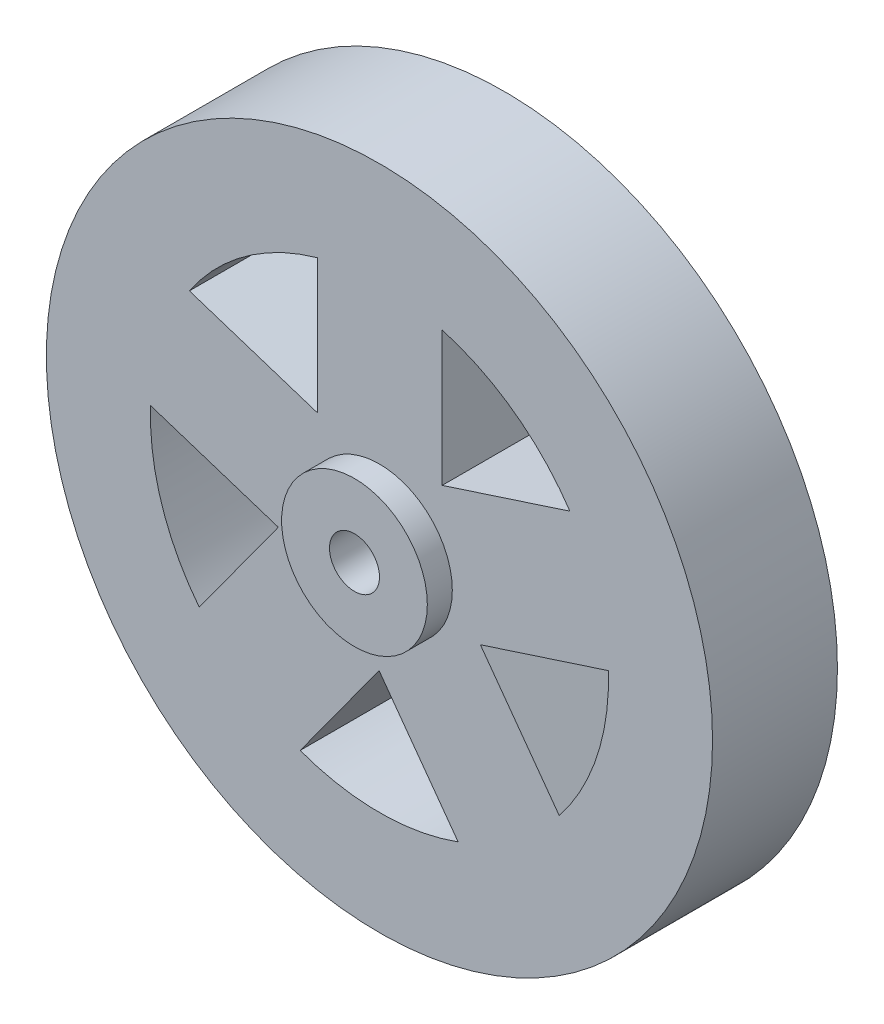
ISO-10303-21;
HEADER;
FILE_DESCRIPTION(('STEP AP214'),'2;1');
FILE_NAME('part.step','',(''),(''),'','','');
FILE_SCHEMA(('AUTOMOTIVE_DESIGN { 1 0 10303 214 1 1 1 1 }'));
ENDSEC;
DATA;
#1=APPLICATION_CONTEXT('core data for automotive mechanical design processes');
#2=APPLICATION_PROTOCOL_DEFINITION('international standard','automotive_design',2000,#1);
#3=PRODUCT_CONTEXT('',#1,'mechanical');
#4=PRODUCT('Part','Part','',(#3));
#5=PRODUCT_RELATED_PRODUCT_CATEGORY('part','',(#4));
#6=PRODUCT_DEFINITION_FORMATION('','',#4);
#7=PRODUCT_DEFINITION_CONTEXT('part definition',#1,'design');
#8=PRODUCT_DEFINITION('design','',#6,#7);
#9=PRODUCT_DEFINITION_SHAPE('','',#8);
#10=(LENGTH_UNIT() NAMED_UNIT(*) SI_UNIT(.MILLI.,.METRE.));
#11=(NAMED_UNIT(*) PLANE_ANGLE_UNIT() SI_UNIT($,.RADIAN.));
#12=(NAMED_UNIT(*) SI_UNIT($,.STERADIAN.) SOLID_ANGLE_UNIT());
#13=UNCERTAINTY_MEASURE_WITH_UNIT(LENGTH_MEASURE(1.E-05),#10,'distance_accuracy_value','');
#14=(GEOMETRIC_REPRESENTATION_CONTEXT(3) GLOBAL_UNCERTAINTY_ASSIGNED_CONTEXT((#13)) GLOBAL_UNIT_ASSIGNED_CONTEXT((#10,
#11,#12)) REPRESENTATION_CONTEXT('',''));
#15=CARTESIAN_POINT('',(0.,0.,0.));
#16=DIRECTION('',(0.,0.,1.));
#17=DIRECTION('',(1.,0.,0.));
#18=AXIS2_PLACEMENT_3D('',#15,#16,#17);
#19=CARTESIAN_POINT('',(7.53732450032553,40.001,0.));
#20=DIRECTION('',(-1.,0.,0.));
#21=DIRECTION('',(0.,0.,1.));
#22=AXIS2_PLACEMENT_3D('',#19,#20,#21);
#23=PLANE('',#22);
#24=DIRECTION('',(0.,0.,1.));
#25=VECTOR('',#24,1.);
#26=CARTESIAN_POINT('',(7.53732450032553,10.2957465667107,0.));
#27=LINE('',#26,#25);
#28=CARTESIAN_POINT('',(7.53732450032553,10.2957465667107,0.));
#29=VERTEX_POINT('',#28);
#30=CARTESIAN_POINT('',(7.53732450032553,10.2957465667107,15.));
#31=VERTEX_POINT('',#30);
#32=EDGE_CURVE('E223',#29,#31,#27,.T.);
#33=ORIENTED_EDGE('',*,*,#32,.F.);
#34=DIRECTION('',(0.,-1.,0.));
#35=VECTOR('',#34,1.);
#36=CARTESIAN_POINT('',(7.53732450032553,40.001,0.));
#37=LINE('',#36,#35);
#38=CARTESIAN_POINT('',(7.53732450032553,26.4469041548683,0.));
#39=VERTEX_POINT('',#38);
#40=EDGE_CURVE('E222',#39,#29,#37,.T.);
#41=ORIENTED_EDGE('',*,*,#40,.F.);
#42=DIRECTION('',(0.,0.,1.));
#43=VECTOR('',#42,1.);
#44=CARTESIAN_POINT('',(7.53732450032553,26.4469041548683,0.));
#45=LINE('',#44,#43);
#46=CARTESIAN_POINT('',(7.53732450032553,26.4469041548683,15.));
#47=VERTEX_POINT('',#46);
#48=EDGE_CURVE('E212',#47,#39,#45,.F.);
#49=ORIENTED_EDGE('',*,*,#48,.F.);
#50=DIRECTION('',(0.,-1.,0.));
#51=VECTOR('',#50,1.);
#52=CARTESIAN_POINT('',(7.53732450032553,40.001,15.));
#53=LINE('',#52,#51);
#54=EDGE_CURVE('E218',#47,#31,#53,.T.);
#55=ORIENTED_EDGE('',*,*,#54,.T.);
#56=EDGE_LOOP('',(#33,#41,#49,#55));
#57=FACE_BOUND('',#56,.T.);
#58=ADVANCED_FACE('F43',(#57),#23,.F.);
#59=CARTESIAN_POINT('',(-7.46267549967447,40.001,0.));
#60=DIRECTION('',(1.,0.,0.));
#61=DIRECTION('',(0.,0.,-1.));
#62=AXIS2_PLACEMENT_3D('',#59,#60,#61);
#63=PLANE('',#62);
#64=DIRECTION('',(0.,0.,-1.));
#65=VECTOR('',#64,1.);
#66=CARTESIAN_POINT('',(-7.46267549967447,10.349982240357,0.));
#67=LINE('',#66,#65);
#68=CARTESIAN_POINT('',(-7.46267549967447,10.349982240357,15.));
#69=VERTEX_POINT('',#68);
#70=CARTESIAN_POINT('',(-7.46267549967447,10.349982240357,0.));
#71=VERTEX_POINT('',#70);
#72=EDGE_CURVE('E157',#69,#71,#67,.T.);
#73=ORIENTED_EDGE('',*,*,#72,.F.);
#74=DIRECTION('',(0.,-1.,0.));
#75=VECTOR('',#74,1.);
#76=CARTESIAN_POINT('',(-7.46267549967447,40.001,15.));
#77=LINE('',#76,#75);
#78=CARTESIAN_POINT('',(-7.46267549967447,26.4680651802613,15.));
#79=VERTEX_POINT('',#78);
#80=EDGE_CURVE('E215',#79,#69,#77,.T.);
#81=ORIENTED_EDGE('',*,*,#80,.F.);
#82=DIRECTION('',(0.,0.,1.));
#83=VECTOR('',#82,1.);
#84=CARTESIAN_POINT('',(-7.46267549967447,26.4680651802613,0.));
#85=LINE('',#84,#83);
#86=CARTESIAN_POINT('',(-7.46267549967447,26.4680651802613,0.));
#87=VERTEX_POINT('',#86);
#88=EDGE_CURVE('E204',#87,#79,#85,.T.);
#89=ORIENTED_EDGE('',*,*,#88,.F.);
#90=DIRECTION('',(0.,-1.,0.));
#91=VECTOR('',#90,1.);
#92=CARTESIAN_POINT('',(-7.46267549967447,40.001,0.));
#93=LINE('',#92,#91);
#94=EDGE_CURVE('E179',#87,#71,#93,.T.);
#95=ORIENTED_EDGE('',*,*,#94,.T.);
#96=EDGE_LOOP('',(#73,#81,#89,#95));
#97=FACE_BOUND('',#96,.T.);
#98=ADVANCED_FACE('F390',(#97),#63,.F.);
#99=CARTESIAN_POINT('',(0.,0.,0.));
#100=DIRECTION('',(0.,0.,1.));
#101=DIRECTION('',(1.,0.,0.));
#102=AXIS2_PLACEMENT_3D('',#99,#100,#101);
#103=CYLINDRICAL_SURFACE('',#102,27.5);
#104=DIRECTION('',(0.,0.,1.));
#105=VECTOR('',#104,1.);
#106=CARTESIAN_POINT('',(27.4816618950402,1.00412125099394,0.));
#107=LINE('',#106,#105);
#108=CARTESIAN_POINT('',(27.4816618950402,1.00412125099394,15.));
#109=VERTEX_POINT('',#108);
#110=CARTESIAN_POINT('',(27.4816618950402,1.00412125099394,0.));
#111=VERTEX_POINT('',#110);
#112=EDGE_CURVE('E238',#109,#111,#107,.F.);
#113=ORIENTED_EDGE('',*,*,#112,.T.);
#114=CARTESIAN_POINT('',(0.,0.,0.));
#115=DIRECTION('',(0.,0.,1.));
#116=DIRECTION('',(1.,0.,0.));
#117=AXIS2_PLACEMENT_3D('',#114,#115,#116);
#118=CIRCLE('',#117,27.5);
#119=CARTESIAN_POINT('',(21.5949696724156,-17.0266639377023,0.));
#120=VERTEX_POINT('',#119);
#121=EDGE_CURVE('E192',#120,#111,#118,.T.);
#122=ORIENTED_EDGE('',*,*,#121,.F.);
#123=DIRECTION('',(0.,0.,1.));
#124=VECTOR('',#123,1.);
#125=CARTESIAN_POINT('',(21.5949696724156,-17.0266639377023,0.));
#126=LINE('',#125,#124);
#127=CARTESIAN_POINT('',(21.5949696724156,-17.0266639377023,15.));
#128=VERTEX_POINT('',#127);
#129=EDGE_CURVE('E258',#120,#128,#126,.T.);
#130=ORIENTED_EDGE('',*,*,#129,.T.);
#131=CARTESIAN_POINT('',(0.,0.,15.));
#132=DIRECTION('',(0.,0.,1.));
#133=DIRECTION('',(1.,0.,0.));
#134=AXIS2_PLACEMENT_3D('',#131,#132,#133);
#135=CIRCLE('',#134,27.5);
#136=EDGE_CURVE('E203',#128,#109,#135,.T.);
#137=ORIENTED_EDGE('',*,*,#136,.T.);
#138=EDGE_LOOP('',(#113,#122,#130,#137));
#139=FACE_BOUND('',#138,.T.);
#140=ADVANCED_FACE('F396',(#139),#103,.F.);
#141=DIRECTION('',(0.,0.,1.));
#142=VECTOR('',#141,1.);
#143=CARTESIAN_POINT('',(22.8665323105074,15.2765081118861,0.));
#144=LINE('',#143,#142);
#145=CARTESIAN_POINT('',(22.8665323105074,15.2765081118861,0.));
#146=VERTEX_POINT('',#145);
#147=CARTESIAN_POINT('',(22.8665323105074,15.2765081118861,15.));
#148=VERTEX_POINT('',#147);
#149=EDGE_CURVE('E235',#146,#148,#144,.T.);
#150=ORIENTED_EDGE('',*,*,#149,.T.);
#151=EDGE_CURVE('E198',#148,#47,#135,.T.);
#152=ORIENTED_EDGE('',*,*,#151,.T.);
#153=ORIENTED_EDGE('',*,*,#48,.T.);
#154=EDGE_CURVE('E183',#146,#39,#118,.T.);
#155=ORIENTED_EDGE('',*,*,#154,.F.);
#156=EDGE_LOOP('',(#150,#152,#153,#155));
#157=FACE_BOUND('',#156,.T.);
#158=ADVANCED_FACE('F403',(#157),#103,.F.);
#159=DIRECTION('',(0.,0.,1.));
#160=VECTOR('',#159,1.);
#161=CARTESIAN_POINT('',(-22.8233391696015,15.3409644139257,0.));
#162=LINE('',#161,#160);
#163=CARTESIAN_POINT('',(-22.8233391696015,15.3409644139257,15.));
#164=VERTEX_POINT('',#163);
#165=CARTESIAN_POINT('',(-22.8233391696015,15.3409644139257,0.));
#166=VERTEX_POINT('',#165);
#167=EDGE_CURVE('E154',#164,#166,#162,.F.);
#168=ORIENTED_EDGE('',*,*,#167,.T.);
#169=EDGE_CURVE('E170',#87,#166,#118,.T.);
#170=ORIENTED_EDGE('',*,*,#169,.F.);
#171=ORIENTED_EDGE('',*,*,#88,.T.);
#172=EDGE_CURVE('E172',#79,#164,#135,.T.);
#173=ORIENTED_EDGE('',*,*,#172,.T.);
#174=EDGE_LOOP('',(#168,#170,#171,#173));
#175=FACE_BOUND('',#174,.T.);
#176=ADVANCED_FACE('F168',(#175),#103,.F.);
#177=DIRECTION('',(0.,0.,1.));
#178=VECTOR('',#177,1.);
#179=CARTESIAN_POINT('',(9.44727661814199,-25.826323092928,0.));
#180=LINE('',#179,#178);
#181=CARTESIAN_POINT('',(9.44727661814199,-25.826323092928,15.));
#182=VERTEX_POINT('',#181);
#183=CARTESIAN_POINT('',(9.44727661814199,-25.826323092928,0.));
#184=VERTEX_POINT('',#183);
#185=EDGE_CURVE('E262',#182,#184,#180,.F.);
#186=ORIENTED_EDGE('',*,*,#185,.T.);
#187=CARTESIAN_POINT('',(-9.52010706693152,-25.7995651404081,0.));
#188=VERTEX_POINT('',#187);
#189=EDGE_CURVE('E188',#188,#184,#118,.T.);
#190=ORIENTED_EDGE('',*,*,#189,.F.);
#191=DIRECTION('',(0.,0.,1.));
#192=VECTOR('',#191,1.);
#193=CARTESIAN_POINT('',(-9.52010706693152,-25.7995651404081,0.));
#194=LINE('',#193,#192);
#195=CARTESIAN_POINT('',(-9.52010706693152,-25.7995651404081,15.));
#196=VERTEX_POINT('',#195);
#197=EDGE_CURVE('E283',#188,#196,#194,.T.);
#198=ORIENTED_EDGE('',*,*,#197,.T.);
#199=EDGE_CURVE('E201',#196,#182,#135,.T.);
#200=ORIENTED_EDGE('',*,*,#199,.T.);
#201=EDGE_LOOP('',(#186,#190,#198,#200));
#202=FACE_BOUND('',#201,.T.);
#203=ADVANCED_FACE('F409',(#202),#103,.F.);
#204=DIRECTION('',(0.,0.,1.));
#205=VECTOR('',#204,1.);
#206=CARTESIAN_POINT('',(-21.6429238439063,-16.9656667268596,0.));
#207=LINE('',#206,#205);
#208=CARTESIAN_POINT('',(-21.6429238439063,-16.9656667268596,15.));
#209=VERTEX_POINT('',#208);
#210=CARTESIAN_POINT('',(-21.6429238439063,-16.9656667268596,0.));
#211=VERTEX_POINT('',#210);
#212=EDGE_CURVE('E287',#209,#211,#207,.F.);
#213=ORIENTED_EDGE('',*,*,#212,.T.);
#214=CARTESIAN_POINT('',(-27.4787194163173,1.08165578596325,0.));
#215=VERTEX_POINT('',#214);
#216=EDGE_CURVE('E181',#215,#211,#118,.T.);
#217=ORIENTED_EDGE('',*,*,#216,.F.);
#218=DIRECTION('',(0.,0.,1.));
#219=VECTOR('',#218,1.);
#220=CARTESIAN_POINT('',(-27.4787194163173,1.08165578596325,0.));
#221=LINE('',#220,#219);
#222=CARTESIAN_POINT('',(-27.4787194163173,1.08165578596326,15.));
#223=VERTEX_POINT('',#222);
#224=EDGE_CURVE('E174',#215,#223,#221,.T.);
#225=ORIENTED_EDGE('',*,*,#224,.T.);
#226=EDGE_CURVE('E197',#223,#209,#135,.T.);
#227=ORIENTED_EDGE('',*,*,#226,.T.);
#228=EDGE_LOOP('',(#213,#217,#225,#227));
#229=FACE_BOUND('',#228,.T.);
#230=ADVANCED_FACE('F379',(#229),#103,.F.);
#231=CARTESIAN_POINT('',(0.,0.,15.));
#232=DIRECTION('',(0.,0.,-1.));
#233=DIRECTION('',(-1.,0.,0.));
#234=AXIS2_PLACEMENT_3D('',#231,#232,#233);
#235=CYLINDRICAL_SURFACE('',#234,40.);
#236=CARTESIAN_POINT('',(0.,0.,15.));
#237=DIRECTION('',(0.,0.,1.));
#238=DIRECTION('',(1.,0.,0.));
#239=AXIS2_PLACEMENT_3D('',#236,#237,#238);
#240=CIRCLE('',#239,40.);
#241=CARTESIAN_POINT('',(40.,0.,15.));
#242=VERTEX_POINT('',#241);
#243=EDGE_CURVE('E11',#242,#242,#240,.T.);
#244=ORIENTED_EDGE('',*,*,#243,.F.);
#245=EDGE_LOOP('',(#244));
#246=FACE_BOUND('',#245,.T.);
#247=CARTESIAN_POINT('',(0.,0.,0.));
#248=DIRECTION('',(0.,0.,1.));
#249=DIRECTION('',(1.,0.,0.));
#250=AXIS2_PLACEMENT_3D('',#247,#248,#249);
#251=CIRCLE('',#250,40.);
#252=CARTESIAN_POINT('',(40.,0.,0.));
#253=VERTEX_POINT('',#252);
#254=EDGE_CURVE('E47',#253,#253,#251,.T.);
#255=ORIENTED_EDGE('',*,*,#254,.T.);
#256=EDGE_LOOP('',(#255));
#257=FACE_BOUND('',#256,.T.);
#258=ADVANCED_FACE('F45',(#246,#257),#235,.T.);
#259=CARTESIAN_POINT('',(0.,0.,15.));
#260=DIRECTION('',(0.,0.,1.));
#261=DIRECTION('',(1.,0.,0.));
#262=AXIS2_PLACEMENT_3D('',#259,#260,#261);
#263=PLANE('',#262);
#264=CARTESIAN_POINT('',(0.,0.,15.));
#265=DIRECTION('',(0.,0.,1.));
#266=DIRECTION('',(1.,0.,0.));
#267=AXIS2_PLACEMENT_3D('',#264,#265,#266);
#268=CIRCLE('',#267,8.75);
#269=CARTESIAN_POINT('',(8.75,0.,15.));
#270=VERTEX_POINT('',#269);
#271=EDGE_CURVE('E322',#270,#270,#268,.T.);
#272=ORIENTED_EDGE('',*,*,#271,.F.);
#273=EDGE_LOOP('',(#272));
#274=FACE_BOUND('',#273,.T.);
#275=ORIENTED_EDGE('',*,*,#80,.T.);
#276=DIRECTION('',(0.95105651629515,-0.309016994374958,0.));
#277=VECTOR('',#276,1.);
#278=CARTESIAN_POINT('',(-45.6080819717525,22.7441761239458,15.));
#279=LINE('',#278,#277);
#280=EDGE_CURVE('E164',#164,#69,#279,.T.);
#281=ORIENTED_EDGE('',*,*,#280,.F.);
#282=ORIENTED_EDGE('',*,*,#172,.F.);
#283=EDGE_LOOP('',(#275,#281,#282));
#284=FACE_BOUND('',#283,.T.);
#285=DIRECTION('',(-0.951056516295155,-0.309016994374945,0.));
#286=VECTOR('',#285,1.);
#287=CARTESIAN_POINT('',(45.6311497815668,22.6731807054409,15.));
#288=LINE('',#287,#286);
#289=EDGE_CURVE('E242',#148,#31,#288,.T.);
#290=ORIENTED_EDGE('',*,*,#289,.T.);
#291=ORIENTED_EDGE('',*,*,#54,.F.);
#292=ORIENTED_EDGE('',*,*,#151,.F.);
#293=EDGE_LOOP('',(#290,#291,#292));
#294=FACE_BOUND('',#293,.T.);
#295=DIRECTION('',(-0.951056516295155,-0.309016994374945,0.));
#296=VECTOR('',#295,1.);
#297=CARTESIAN_POINT('',(50.2664046971909,8.4073329610136,15.));
#298=LINE('',#297,#296);
#299=CARTESIAN_POINT('',(12.1209982251129,-3.9868609225746,15.));
#300=VERTEX_POINT('',#299);
#301=EDGE_CURVE('E243',#109,#300,#298,.T.);
#302=ORIENTED_EDGE('',*,*,#301,.F.);
#303=ORIENTED_EDGE('',*,*,#136,.F.);
#304=DIRECTION('',(-0.587785252292469,0.809016994374951,0.));
#305=VECTOR('',#304,1.);
#306=CARTESIAN_POINT('',(38.879042760907,-40.8161496488045,15.));
#307=LINE('',#306,#305);
#308=EDGE_CURVE('E266',#128,#300,#307,.T.);
#309=ORIENTED_EDGE('',*,*,#308,.T.);
#310=EDGE_LOOP('',(#302,#303,#309));
#311=FACE_BOUND('',#310,.T.);
#312=DIRECTION('',(-0.587785252292469,0.809016994374951,0.));
#313=VECTOR('',#312,1.);
#314=CARTESIAN_POINT('',(26.7437878452828,-49.6329284331915,15.));
#315=LINE('',#314,#313);
#316=CARTESIAN_POINT('',(-0.0461356196286538,-12.7597621252806,15.));
#317=VERTEX_POINT('',#316);
#318=EDGE_CURVE('E267',#182,#317,#315,.T.);
#319=ORIENTED_EDGE('',*,*,#318,.F.);
#320=ORIENTED_EDGE('',*,*,#199,.F.);
#321=DIRECTION('',(0.58778525229248,0.809016994374942,0.));
#322=VECTOR('',#321,1.);
#323=CARTESIAN_POINT('',(-26.8041801554234,-49.5890508515102,15.));
#324=LINE('',#323,#322);
#325=EDGE_CURVE('E291',#196,#317,#324,.T.);
#326=ORIENTED_EDGE('',*,*,#325,.T.);
#327=EDGE_LOOP('',(#319,#320,#326));
#328=FACE_BOUND('',#327,.T.);
#329=DIRECTION('',(0.58778525229248,0.809016994374942,0.));
#330=VECTOR('',#329,1.);
#331=CARTESIAN_POINT('',(-38.9394350710475,-40.772272067123,15.));
#332=LINE('',#331,#330);
#333=CARTESIAN_POINT('',(-12.1495116061355,-3.8991057592123,15.));
#334=VERTEX_POINT('',#333);
#335=EDGE_CURVE('E292',#209,#334,#332,.T.);
#336=ORIENTED_EDGE('',*,*,#335,.F.);
#337=ORIENTED_EDGE('',*,*,#226,.F.);
#338=DIRECTION('',(0.95105651629515,-0.309016994374958,0.));
#339=VECTOR('',#338,1.);
#340=CARTESIAN_POINT('',(-50.2433368873769,8.47832837951854,15.));
#341=LINE('',#340,#339);
#342=EDGE_CURVE('E175',#223,#334,#341,.T.);
#343=ORIENTED_EDGE('',*,*,#342,.T.);
#344=EDGE_LOOP('',(#336,#337,#343));
#345=FACE_BOUND('',#344,.T.);
#346=ORIENTED_EDGE('',*,*,#243,.T.);
#347=EDGE_LOOP('',(#346));
#348=FACE_BOUND('',#347,.T.);
#349=ADVANCED_FACE('F358',(#274,#284,#294,#311,#328,#345,#348),#263,.T.);
#350=CARTESIAN_POINT('',(0.,0.,0.));
#351=DIRECTION('',(0.,0.,1.));
#352=DIRECTION('',(1.,0.,0.));
#353=AXIS2_PLACEMENT_3D('',#350,#351,#352);
#354=PLANE('',#353);
#355=CARTESIAN_POINT('',(0.,0.,0.));
#356=DIRECTION('',(0.,0.,1.));
#357=DIRECTION('',(1.,0.,0.));
#358=AXIS2_PLACEMENT_3D('',#355,#356,#357);
#359=CIRCLE('',#358,3.);
#360=CARTESIAN_POINT('',(3.,0.,0.));
#361=VERTEX_POINT('',#360);
#362=EDGE_CURVE('E326',#361,#361,#359,.T.);
#363=ORIENTED_EDGE('',*,*,#362,.T.);
#364=EDGE_LOOP('',(#363));
#365=FACE_BOUND('',#364,.T.);
#366=ORIENTED_EDGE('',*,*,#40,.T.);
#367=DIRECTION('',(-0.951056516295155,-0.309016994374945,0.));
#368=VECTOR('',#367,1.);
#369=CARTESIAN_POINT('',(45.6311497815668,22.6731807054409,0.));
#370=LINE('',#369,#368);
#371=EDGE_CURVE('E59',#146,#29,#370,.T.);
#372=ORIENTED_EDGE('',*,*,#371,.F.);
#373=ORIENTED_EDGE('',*,*,#154,.T.);
#374=EDGE_LOOP('',(#366,#372,#373));
#375=FACE_BOUND('',#374,.T.);
#376=ORIENTED_EDGE('',*,*,#121,.T.);
#377=DIRECTION('',(-0.951056516295155,-0.309016994374945,0.));
#378=VECTOR('',#377,1.);
#379=CARTESIAN_POINT('',(50.2664046971909,8.4073329610136,0.));
#380=LINE('',#379,#378);
#381=CARTESIAN_POINT('',(12.1209982251129,-3.9868609225746,0.));
#382=VERTEX_POINT('',#381);
#383=EDGE_CURVE('E247',#111,#382,#380,.T.);
#384=ORIENTED_EDGE('',*,*,#383,.T.);
#385=DIRECTION('',(-0.587785252292469,0.809016994374951,0.));
#386=VECTOR('',#385,1.);
#387=CARTESIAN_POINT('',(38.879042760907,-40.8161496488045,0.));
#388=LINE('',#387,#386);
#389=EDGE_CURVE('E67',#120,#382,#388,.T.);
#390=ORIENTED_EDGE('',*,*,#389,.F.);
#391=EDGE_LOOP('',(#376,#384,#390));
#392=FACE_BOUND('',#391,.T.);
#393=DIRECTION('',(0.95105651629515,-0.309016994374958,0.));
#394=VECTOR('',#393,1.);
#395=CARTESIAN_POINT('',(-45.6080819717525,22.7441761239458,0.));
#396=LINE('',#395,#394);
#397=EDGE_CURVE('E151',#166,#71,#396,.T.);
#398=ORIENTED_EDGE('',*,*,#397,.T.);
#399=ORIENTED_EDGE('',*,*,#94,.F.);
#400=ORIENTED_EDGE('',*,*,#169,.T.);
#401=EDGE_LOOP('',(#398,#399,#400));
#402=FACE_BOUND('',#401,.T.);
#403=DIRECTION('',(0.58778525229248,0.809016994374942,0.));
#404=VECTOR('',#403,1.);
#405=CARTESIAN_POINT('',(-26.8041801554234,-49.5890508515102,0.));
#406=LINE('',#405,#404);
#407=CARTESIAN_POINT('',(-0.0461356196286538,-12.7597621252806,0.));
#408=VERTEX_POINT('',#407);
#409=EDGE_CURVE('E300',#188,#408,#406,.T.);
#410=ORIENTED_EDGE('',*,*,#409,.F.);
#411=ORIENTED_EDGE('',*,*,#189,.T.);
#412=DIRECTION('',(-0.587785252292469,0.809016994374951,0.));
#413=VECTOR('',#412,1.);
#414=CARTESIAN_POINT('',(26.7437878452828,-49.6329284331915,0.));
#415=LINE('',#414,#413);
#416=EDGE_CURVE('E270',#184,#408,#415,.T.);
#417=ORIENTED_EDGE('',*,*,#416,.T.);
#418=EDGE_LOOP('',(#410,#411,#417));
#419=FACE_BOUND('',#418,.T.);
#420=ORIENTED_EDGE('',*,*,#216,.T.);
#421=DIRECTION('',(0.58778525229248,0.809016994374942,0.));
#422=VECTOR('',#421,1.);
#423=CARTESIAN_POINT('',(-38.9394350710475,-40.772272067123,0.));
#424=LINE('',#423,#422);
#425=CARTESIAN_POINT('',(-12.1495116061355,-3.89910575921231,0.));
#426=VERTEX_POINT('',#425);
#427=EDGE_CURVE('E295',#211,#426,#424,.T.);
#428=ORIENTED_EDGE('',*,*,#427,.T.);
#429=DIRECTION('',(0.95105651629515,-0.309016994374958,0.));
#430=VECTOR('',#429,1.);
#431=CARTESIAN_POINT('',(-50.2433368873769,8.47832837951854,0.));
#432=LINE('',#431,#430);
#433=EDGE_CURVE('E163',#215,#426,#432,.T.);
#434=ORIENTED_EDGE('',*,*,#433,.F.);
#435=EDGE_LOOP('',(#420,#428,#434));
#436=FACE_BOUND('',#435,.T.);
#437=ORIENTED_EDGE('',*,*,#254,.F.);
#438=EDGE_LOOP('',(#437));
#439=FACE_BOUND('',#438,.T.);
#440=ADVANCED_FACE('F177',(#365,#375,#392,#402,#419,#436,#439),#354,.F.);
#441=CARTESIAN_POINT('',(45.6311497815668,22.6731807054409,0.));
#442=DIRECTION('',(0.309016994374945,-0.951056516295155,0.));
#443=DIRECTION('',(0.951056516295155,0.309016994374945,0.));
#444=AXIS2_PLACEMENT_3D('',#441,#442,#443);
#445=PLANE('',#444);
#446=ORIENTED_EDGE('',*,*,#371,.T.);
#447=ORIENTED_EDGE('',*,*,#32,.T.);
#448=ORIENTED_EDGE('',*,*,#289,.F.);
#449=ORIENTED_EDGE('',*,*,#149,.F.);
#450=EDGE_LOOP('',(#446,#447,#448,#449));
#451=FACE_BOUND('',#450,.T.);
#452=ADVANCED_FACE('F383',(#451),#445,.F.);
#453=CARTESIAN_POINT('',(-45.6080819717525,22.7441761239458,0.));
#454=DIRECTION('',(-0.309016994374958,-0.95105651629515,0.));
#455=DIRECTION('',(0.95105651629515,-0.309016994374958,0.));
#456=AXIS2_PLACEMENT_3D('',#453,#454,#455);
#457=PLANE('',#456);
#458=ORIENTED_EDGE('',*,*,#280,.T.);
#459=ORIENTED_EDGE('',*,*,#72,.T.);
#460=ORIENTED_EDGE('',*,*,#397,.F.);
#461=ORIENTED_EDGE('',*,*,#167,.F.);
#462=EDGE_LOOP('',(#458,#459,#460,#461));
#463=FACE_BOUND('',#462,.T.);
#464=ADVANCED_FACE('F153',(#463),#457,.F.);
#465=CARTESIAN_POINT('',(50.2664046971909,8.4073329610136,0.));
#466=DIRECTION('',(-0.309016994374945,0.951056516295155,0.));
#467=DIRECTION('',(-0.951056516295155,-0.309016994374945,0.));
#468=AXIS2_PLACEMENT_3D('',#465,#466,#467);
#469=PLANE('',#468);
#470=DIRECTION('',(0.,0.,1.));
#471=VECTOR('',#470,1.);
#472=CARTESIAN_POINT('',(12.1209982251129,-3.98686092257461,0.));
#473=LINE('',#472,#471);
#474=EDGE_CURVE('E248',#382,#300,#473,.T.);
#475=ORIENTED_EDGE('',*,*,#474,.F.);
#476=ORIENTED_EDGE('',*,*,#383,.F.);
#477=ORIENTED_EDGE('',*,*,#112,.F.);
#478=ORIENTED_EDGE('',*,*,#301,.T.);
#479=EDGE_LOOP('',(#475,#476,#477,#478));
#480=FACE_BOUND('',#479,.T.);
#481=ADVANCED_FACE('F437',(#480),#469,.F.);
#482=CARTESIAN_POINT('',(38.879042760907,-40.8161496488045,0.));
#483=DIRECTION('',(-0.809016994374951,-0.587785252292469,0.));
#484=DIRECTION('',(0.587785252292469,-0.809016994374951,0.));
#485=AXIS2_PLACEMENT_3D('',#482,#483,#484);
#486=PLANE('',#485);
#487=ORIENTED_EDGE('',*,*,#389,.T.);
#488=ORIENTED_EDGE('',*,*,#474,.T.);
#489=ORIENTED_EDGE('',*,*,#308,.F.);
#490=ORIENTED_EDGE('',*,*,#129,.F.);
#491=EDGE_LOOP('',(#487,#488,#489,#490));
#492=FACE_BOUND('',#491,.T.);
#493=ADVANCED_FACE('F434',(#492),#486,.F.);
#494=CARTESIAN_POINT('',(26.7437878452828,-49.6329284331915,0.));
#495=DIRECTION('',(0.809016994374951,0.587785252292469,0.));
#496=DIRECTION('',(-0.587785252292469,0.809016994374951,0.));
#497=AXIS2_PLACEMENT_3D('',#494,#495,#496);
#498=PLANE('',#497);
#499=DIRECTION('',(0.,0.,1.));
#500=VECTOR('',#499,1.);
#501=CARTESIAN_POINT('',(-0.0461356196286566,-12.7597621252806,0.));
#502=LINE('',#501,#500);
#503=EDGE_CURVE('E271',#408,#317,#502,.T.);
#504=ORIENTED_EDGE('',*,*,#503,.F.);
#505=ORIENTED_EDGE('',*,*,#416,.F.);
#506=ORIENTED_EDGE('',*,*,#185,.F.);
#507=ORIENTED_EDGE('',*,*,#318,.T.);
#508=EDGE_LOOP('',(#504,#505,#506,#507));
#509=FACE_BOUND('',#508,.T.);
#510=ADVANCED_FACE('F429',(#509),#498,.F.);
#511=CARTESIAN_POINT('',(-26.8041801554234,-49.5890508515102,0.));
#512=DIRECTION('',(-0.809016994374942,0.58778525229248,0.));
#513=DIRECTION('',(-0.58778525229248,-0.809016994374942,0.));
#514=AXIS2_PLACEMENT_3D('',#511,#512,#513);
#515=PLANE('',#514);
#516=ORIENTED_EDGE('',*,*,#409,.T.);
#517=ORIENTED_EDGE('',*,*,#503,.T.);
#518=ORIENTED_EDGE('',*,*,#325,.F.);
#519=ORIENTED_EDGE('',*,*,#197,.F.);
#520=EDGE_LOOP('',(#516,#517,#518,#519));
#521=FACE_BOUND('',#520,.T.);
#522=ADVANCED_FACE('F422',(#521),#515,.F.);
#523=CARTESIAN_POINT('',(-38.9394350710475,-40.772272067123,0.));
#524=DIRECTION('',(0.809016994374942,-0.58778525229248,0.));
#525=DIRECTION('',(0.58778525229248,0.809016994374942,0.));
#526=AXIS2_PLACEMENT_3D('',#523,#524,#525);
#527=PLANE('',#526);
#528=DIRECTION('',(0.,0.,1.));
#529=VECTOR('',#528,1.);
#530=CARTESIAN_POINT('',(-12.1495116061355,-3.89910575921231,0.));
#531=LINE('',#530,#529);
#532=EDGE_CURVE('E296',#426,#334,#531,.T.);
#533=ORIENTED_EDGE('',*,*,#532,.F.);
#534=ORIENTED_EDGE('',*,*,#427,.F.);
#535=ORIENTED_EDGE('',*,*,#212,.F.);
#536=ORIENTED_EDGE('',*,*,#335,.T.);
#537=EDGE_LOOP('',(#533,#534,#535,#536));
#538=FACE_BOUND('',#537,.T.);
#539=ADVANCED_FACE('F420',(#538),#527,.F.);
#540=CARTESIAN_POINT('',(-50.2433368873769,8.47832837951854,0.));
#541=DIRECTION('',(0.309016994374958,0.95105651629515,0.));
#542=DIRECTION('',(-0.95105651629515,0.309016994374958,0.));
#543=AXIS2_PLACEMENT_3D('',#540,#541,#542);
#544=PLANE('',#543);
#545=ORIENTED_EDGE('',*,*,#433,.T.);
#546=ORIENTED_EDGE('',*,*,#532,.T.);
#547=ORIENTED_EDGE('',*,*,#342,.F.);
#548=ORIENTED_EDGE('',*,*,#224,.F.);
#549=EDGE_LOOP('',(#545,#546,#547,#548));
#550=FACE_BOUND('',#549,.T.);
#551=ADVANCED_FACE('F354',(#550),#544,.F.);
#552=CARTESIAN_POINT('',(0.,0.,18.));
#553=DIRECTION('',(0.,0.,-1.));
#554=DIRECTION('',(-1.,0.,0.));
#555=AXIS2_PLACEMENT_3D('',#552,#553,#554);
#556=CYLINDRICAL_SURFACE('',#555,8.75);
#557=CARTESIAN_POINT('',(0.,0.,18.));
#558=DIRECTION('',(0.,0.,1.));
#559=DIRECTION('',(1.,0.,0.));
#560=AXIS2_PLACEMENT_3D('',#557,#558,#559);
#561=CIRCLE('',#560,8.75);
#562=CARTESIAN_POINT('',(8.75,0.,18.));
#563=VERTEX_POINT('',#562);
#564=EDGE_CURVE('E315',#563,#563,#561,.T.);
#565=ORIENTED_EDGE('',*,*,#564,.F.);
#566=EDGE_LOOP('',(#565));
#567=FACE_BOUND('',#566,.T.);
#568=ORIENTED_EDGE('',*,*,#271,.T.);
#569=EDGE_LOOP('',(#568));
#570=FACE_BOUND('',#569,.T.);
#571=ADVANCED_FACE('F348',(#567,#570),#556,.T.);
#572=CARTESIAN_POINT('',(0.,0.,18.));
#573=DIRECTION('',(0.,0.,1.));
#574=DIRECTION('',(1.,0.,0.));
#575=AXIS2_PLACEMENT_3D('',#572,#573,#574);
#576=PLANE('',#575);
#577=CARTESIAN_POINT('',(0.,0.,18.));
#578=DIRECTION('',(0.,0.,1.));
#579=DIRECTION('',(1.,0.,0.));
#580=AXIS2_PLACEMENT_3D('',#577,#578,#579);
#581=CIRCLE('',#580,3.);
#582=CARTESIAN_POINT('',(3.,0.,18.));
#583=VERTEX_POINT('',#582);
#584=EDGE_CURVE('E330',#583,#583,#581,.T.);
#585=ORIENTED_EDGE('',*,*,#584,.F.);
#586=EDGE_LOOP('',(#585));
#587=FACE_BOUND('',#586,.T.);
#588=ORIENTED_EDGE('',*,*,#564,.T.);
#589=EDGE_LOOP('',(#588));
#590=FACE_BOUND('',#589,.T.);
#591=ADVANCED_FACE('F342',(#587,#590),#576,.T.);
#592=CARTESIAN_POINT('',(0.,0.,0.));
#593=DIRECTION('',(0.,0.,1.));
#594=DIRECTION('',(1.,0.,0.));
#595=AXIS2_PLACEMENT_3D('',#592,#593,#594);
#596=CYLINDRICAL_SURFACE('',#595,3.);
#597=ORIENTED_EDGE('',*,*,#362,.F.);
#598=EDGE_LOOP('',(#597));
#599=FACE_BOUND('',#598,.T.);
#600=ORIENTED_EDGE('',*,*,#584,.T.);
#601=EDGE_LOOP('',(#600));
#602=FACE_BOUND('',#601,.T.);
#603=ADVANCED_FACE('F339',(#599,#602),#596,.F.);
#604=CLOSED_SHELL('',(#58,#98,#140,#158,#176,#203,#230,#258,#349,#440,#452,#464,#481,#493,#510,
#522,#539,#551,#571,#591,#603));
#605=MANIFOLD_SOLID_BREP('B2',#604);
#606=ADVANCED_BREP_SHAPE_REPRESENTATION('',(#18,#605),#14);
#607=SHAPE_DEFINITION_REPRESENTATION(#9,#606);
ENDSEC;
END-ISO-10303-21;
